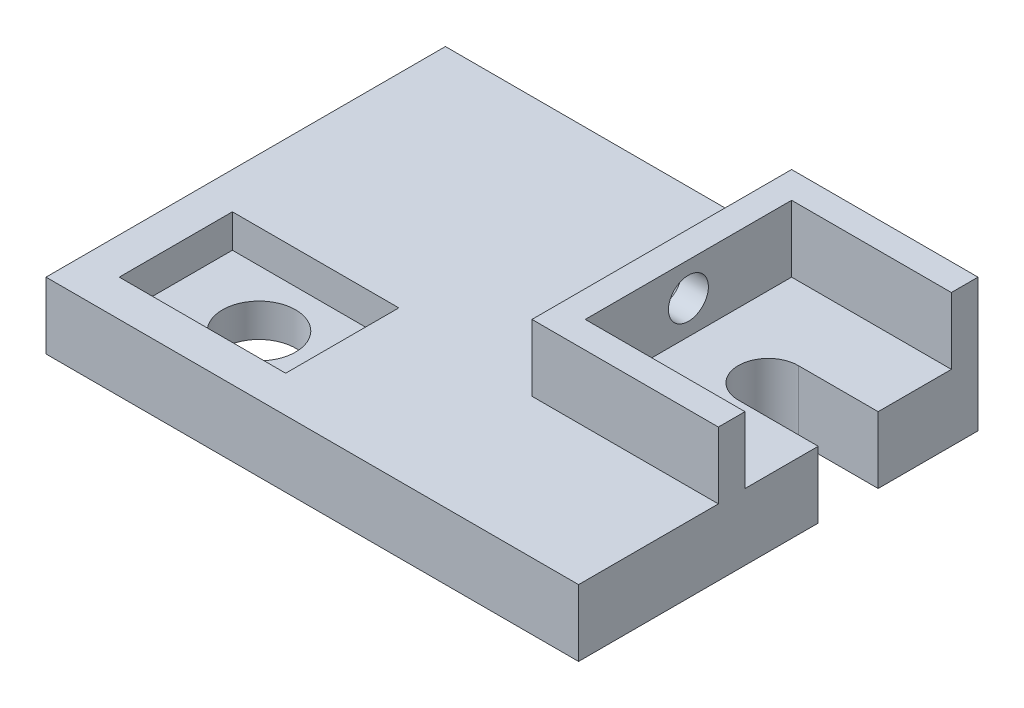
ISO-10303-21;
HEADER;
FILE_DESCRIPTION(('STEP AP214'),'2;1');
FILE_NAME('part.step','',(''),(''),'','','');
FILE_SCHEMA(('AUTOMOTIVE_DESIGN { 1 0 10303 214 1 1 1 1 }'));
ENDSEC;
DATA;
#1=APPLICATION_CONTEXT('core data for automotive mechanical design processes');
#2=APPLICATION_PROTOCOL_DEFINITION('international standard','automotive_design',2000,#1);
#3=PRODUCT_CONTEXT('',#1,'mechanical');
#4=PRODUCT('Part','Part','',(#3));
#5=PRODUCT_RELATED_PRODUCT_CATEGORY('part','',(#4));
#6=PRODUCT_DEFINITION_FORMATION('','',#4);
#7=PRODUCT_DEFINITION_CONTEXT('part definition',#1,'design');
#8=PRODUCT_DEFINITION('design','',#6,#7);
#9=PRODUCT_DEFINITION_SHAPE('','',#8);
#10=(LENGTH_UNIT() NAMED_UNIT(*) SI_UNIT(.MILLI.,.METRE.));
#11=(NAMED_UNIT(*) PLANE_ANGLE_UNIT() SI_UNIT($,.RADIAN.));
#12=(NAMED_UNIT(*) SI_UNIT($,.STERADIAN.) SOLID_ANGLE_UNIT());
#13=UNCERTAINTY_MEASURE_WITH_UNIT(LENGTH_MEASURE(1.E-05),#10,'distance_accuracy_value','');
#14=(GEOMETRIC_REPRESENTATION_CONTEXT(3) GLOBAL_UNCERTAINTY_ASSIGNED_CONTEXT((#13)) GLOBAL_UNIT_ASSIGNED_CONTEXT((#10,
#11,#12)) REPRESENTATION_CONTEXT('',''));
#15=CARTESIAN_POINT('',(0.,0.,0.));
#16=DIRECTION('',(0.,0.,1.));
#17=DIRECTION('',(1.,0.,0.));
#18=AXIS2_PLACEMENT_3D('',#15,#16,#17);
#19=CARTESIAN_POINT('',(-22.,0.,16.));
#20=DIRECTION('',(0.,1.,0.));
#21=DIRECTION('',(0.,0.,1.));
#22=AXIS2_PLACEMENT_3D('',#19,#20,#21);
#23=CYLINDRICAL_SURFACE('',#22,5.5);
#24=CARTESIAN_POINT('',(-22.,0.,16.));
#25=DIRECTION('',(0.,1.,0.));
#26=DIRECTION('',(0.,0.,1.));
#27=AXIS2_PLACEMENT_3D('',#24,#25,#26);
#28=CIRCLE('',#27,5.5);
#29=CARTESIAN_POINT('',(-22.,0.,21.5));
#30=VERTEX_POINT('',#29);
#31=EDGE_CURVE('E317',#30,#30,#28,.T.);
#32=ORIENTED_EDGE('',*,*,#31,.F.);
#33=EDGE_LOOP('',(#32));
#34=FACE_BOUND('',#33,.T.);
#35=CARTESIAN_POINT('',(-22.,5.,16.));
#36=DIRECTION('',(0.,1.,0.));
#37=DIRECTION('',(0.,0.,1.));
#38=AXIS2_PLACEMENT_3D('',#35,#36,#37);
#39=CIRCLE('',#38,5.5);
#40=CARTESIAN_POINT('',(-22.,5.,21.5));
#41=VERTEX_POINT('',#40);
#42=EDGE_CURVE('E53',#41,#41,#39,.F.);
#43=ORIENTED_EDGE('',*,*,#42,.F.);
#44=EDGE_LOOP('',(#43));
#45=FACE_BOUND('',#44,.T.);
#46=ADVANCED_FACE('F49',(#34,#45),#23,.F.);
#47=CARTESIAN_POINT('',(0.,10.,0.));
#48=DIRECTION('',(0.,-1.,0.));
#49=DIRECTION('',(0.,0.,-1.));
#50=AXIS2_PLACEMENT_3D('',#47,#48,#49);
#51=PLANE('',#50);
#52=DIRECTION('',(0.,0.,-1.));
#53=VECTOR('',#52,1.);
#54=CARTESIAN_POINT('',(40.,10.,30.));
#55=LINE('',#54,#53);
#56=CARTESIAN_POINT('',(40.,10.,-15.));
#57=VERTEX_POINT('',#56);
#58=CARTESIAN_POINT('',(40.,10.,-26.));
#59=VERTEX_POINT('',#58);
#60=EDGE_CURVE('E334',#57,#59,#55,.T.);
#61=ORIENTED_EDGE('',*,*,#60,.T.);
#62=DIRECTION('',(-1.,0.,0.));
#63=VECTOR('',#62,1.);
#64=CARTESIAN_POINT('',(0.,10.,-26.));
#65=LINE('',#64,#63);
#66=CARTESIAN_POINT('',(16.,10.,-26.));
#67=VERTEX_POINT('',#66);
#68=EDGE_CURVE('E74',#59,#67,#65,.T.);
#69=ORIENTED_EDGE('',*,*,#68,.T.);
#70=DIRECTION('',(0.,0.,1.));
#71=VECTOR('',#70,1.);
#72=CARTESIAN_POINT('',(16.,10.,0.));
#73=LINE('',#72,#71);
#74=CARTESIAN_POINT('',(16.,10.,5.00000000000001));
#75=VERTEX_POINT('',#74);
#76=EDGE_CURVE('E230',#67,#75,#73,.T.);
#77=ORIENTED_EDGE('',*,*,#76,.T.);
#78=DIRECTION('',(-1.,0.,0.));
#79=VECTOR('',#78,1.);
#80=CARTESIAN_POINT('',(0.,10.,5.00000000000001));
#81=LINE('',#80,#79);
#82=CARTESIAN_POINT('',(40.,10.,5.00000000000001));
#83=VERTEX_POINT('',#82);
#84=EDGE_CURVE('E258',#83,#75,#81,.T.);
#85=ORIENTED_EDGE('',*,*,#84,.F.);
#86=CARTESIAN_POINT('',(40.,10.,-6.));
#87=VERTEX_POINT('',#86);
#88=EDGE_CURVE('E285',#83,#87,#55,.T.);
#89=ORIENTED_EDGE('',*,*,#88,.T.);
#90=DIRECTION('',(1.,0.,0.));
#91=VECTOR('',#90,1.);
#92=CARTESIAN_POINT('',(0.,10.,-6.));
#93=LINE('',#92,#91);
#94=CARTESIAN_POINT('',(28.,10.,-6.));
#95=VERTEX_POINT('',#94);
#96=EDGE_CURVE('E300',#95,#87,#93,.T.);
#97=ORIENTED_EDGE('',*,*,#96,.F.);
#98=CARTESIAN_POINT('',(28.,10.,-10.5));
#99=DIRECTION('',(0.,1.,0.));
#100=DIRECTION('',(0.,0.,1.));
#101=AXIS2_PLACEMENT_3D('',#98,#99,#100);
#102=CIRCLE('',#101,4.5);
#103=CARTESIAN_POINT('',(28.,10.,-15.));
#104=VERTEX_POINT('',#103);
#105=EDGE_CURVE('E295',#104,#95,#102,.T.);
#106=ORIENTED_EDGE('',*,*,#105,.F.);
#107=DIRECTION('',(-1.,0.,0.));
#108=VECTOR('',#107,1.);
#109=CARTESIAN_POINT('',(0.,10.,-15.));
#110=LINE('',#109,#108);
#111=EDGE_CURVE('E306',#57,#104,#110,.T.);
#112=ORIENTED_EDGE('',*,*,#111,.F.);
#113=EDGE_LOOP('',(#61,#69,#77,#85,#89,#97,#106,#112));
#114=FACE_BOUND('',#113,.T.);
#115=ADVANCED_FACE('F343',(#114),#51,.F.);
#116=CARTESIAN_POINT('',(40.,10.,30.));
#117=DIRECTION('',(-1.,0.,0.));
#118=DIRECTION('',(0.,0.,1.));
#119=AXIS2_PLACEMENT_3D('',#116,#117,#118);
#120=PLANE('',#119);
#121=ORIENTED_EDGE('',*,*,#60,.F.);
#122=DIRECTION('',(0.,1.,0.));
#123=VECTOR('',#122,1.);
#124=CARTESIAN_POINT('',(40.,0.,-15.));
#125=LINE('',#124,#123);
#126=CARTESIAN_POINT('',(40.,0.,-15.));
#127=VERTEX_POINT('',#126);
#128=EDGE_CURVE('E318',#127,#57,#125,.T.);
#129=ORIENTED_EDGE('',*,*,#128,.F.);
#130=DIRECTION('',(0.,0.,-1.));
#131=VECTOR('',#130,1.);
#132=CARTESIAN_POINT('',(40.,0.,30.));
#133=LINE('',#132,#131);
#134=CARTESIAN_POINT('',(40.,0.,-30.));
#135=VERTEX_POINT('',#134);
#136=EDGE_CURVE('E326',#127,#135,#133,.T.);
#137=ORIENTED_EDGE('',*,*,#136,.T.);
#138=DIRECTION('',(0.,-1.,0.));
#139=VECTOR('',#138,1.);
#140=CARTESIAN_POINT('',(40.,10.,-30.));
#141=LINE('',#140,#139);
#142=CARTESIAN_POINT('',(40.,20.,-30.));
#143=VERTEX_POINT('',#142);
#144=EDGE_CURVE('E13',#143,#135,#141,.T.);
#145=ORIENTED_EDGE('',*,*,#144,.F.);
#146=DIRECTION('',(0.,0.,-1.));
#147=VECTOR('',#146,1.);
#148=CARTESIAN_POINT('',(40.,20.,0.));
#149=LINE('',#148,#147);
#150=CARTESIAN_POINT('',(40.,20.,-26.));
#151=VERTEX_POINT('',#150);
#152=EDGE_CURVE('E229',#151,#143,#149,.T.);
#153=ORIENTED_EDGE('',*,*,#152,.F.);
#154=DIRECTION('',(0.,-1.,0.));
#155=VECTOR('',#154,1.);
#156=CARTESIAN_POINT('',(40.,20.,-26.));
#157=LINE('',#156,#155);
#158=EDGE_CURVE('E292',#151,#59,#157,.T.);
#159=ORIENTED_EDGE('',*,*,#158,.T.);
#160=EDGE_LOOP('',(#121,#129,#137,#145,#153,#159));
#161=FACE_BOUND('',#160,.T.);
#162=ADVANCED_FACE('F397',(#161),#120,.F.);
#163=CARTESIAN_POINT('',(40.,0.,30.));
#164=VERTEX_POINT('',#163);
#165=CARTESIAN_POINT('',(40.,0.,-6.));
#166=VERTEX_POINT('',#165);
#167=EDGE_CURVE('E353',#164,#166,#133,.T.);
#168=ORIENTED_EDGE('',*,*,#167,.T.);
#169=DIRECTION('',(0.,1.,0.));
#170=VECTOR('',#169,1.);
#171=CARTESIAN_POINT('',(40.,0.,-6.));
#172=LINE('',#171,#170);
#173=EDGE_CURVE('E320',#166,#87,#172,.T.);
#174=ORIENTED_EDGE('',*,*,#173,.T.);
#175=ORIENTED_EDGE('',*,*,#88,.F.);
#176=DIRECTION('',(0.,-1.,0.));
#177=VECTOR('',#176,1.);
#178=CARTESIAN_POINT('',(40.,20.,5.00000000000001));
#179=LINE('',#178,#177);
#180=CARTESIAN_POINT('',(40.,20.,5.00000000000001));
#181=VERTEX_POINT('',#180);
#182=EDGE_CURVE('E264',#181,#83,#179,.T.);
#183=ORIENTED_EDGE('',*,*,#182,.F.);
#184=DIRECTION('',(0.,0.,-1.));
#185=VECTOR('',#184,1.);
#186=CARTESIAN_POINT('',(40.,20.,0.));
#187=LINE('',#186,#185);
#188=CARTESIAN_POINT('',(40.,20.,9.00000000000001));
#189=VERTEX_POINT('',#188);
#190=EDGE_CURVE('E240',#189,#181,#187,.T.);
#191=ORIENTED_EDGE('',*,*,#190,.F.);
#192=DIRECTION('',(0.,-1.,0.));
#193=VECTOR('',#192,1.);
#194=CARTESIAN_POINT('',(40.,20.,9.00000000000001));
#195=LINE('',#194,#193);
#196=CARTESIAN_POINT('',(40.,10.,9.));
#197=VERTEX_POINT('',#196);
#198=EDGE_CURVE('E267',#189,#197,#195,.T.);
#199=ORIENTED_EDGE('',*,*,#198,.T.);
#200=CARTESIAN_POINT('',(40.,10.,30.));
#201=VERTEX_POINT('',#200);
#202=EDGE_CURVE('E340',#201,#197,#55,.T.);
#203=ORIENTED_EDGE('',*,*,#202,.F.);
#204=DIRECTION('',(0.,-1.,0.));
#205=VECTOR('',#204,1.);
#206=CARTESIAN_POINT('',(40.,10.,30.));
#207=LINE('',#206,#205);
#208=EDGE_CURVE('E355',#201,#164,#207,.T.);
#209=ORIENTED_EDGE('',*,*,#208,.T.);
#210=EDGE_LOOP('',(#168,#174,#175,#183,#191,#199,#203,#209));
#211=FACE_BOUND('',#210,.T.);
#212=ADVANCED_FACE('F51',(#211),#120,.F.);
#213=CARTESIAN_POINT('',(-40.,10.,-30.));
#214=DIRECTION('',(0.,0.,1.));
#215=DIRECTION('',(1.,0.,0.));
#216=AXIS2_PLACEMENT_3D('',#213,#214,#215);
#217=PLANE('',#216);
#218=DIRECTION('',(-1.,0.,0.));
#219=VECTOR('',#218,1.);
#220=CARTESIAN_POINT('',(-40.,0.,-30.));
#221=LINE('',#220,#219);
#222=CARTESIAN_POINT('',(-40.,0.,-30.));
#223=VERTEX_POINT('',#222);
#224=EDGE_CURVE('E358',#135,#223,#221,.T.);
#225=ORIENTED_EDGE('',*,*,#224,.T.);
#226=DIRECTION('',(0.,-1.,0.));
#227=VECTOR('',#226,1.);
#228=CARTESIAN_POINT('',(-40.,10.,-30.));
#229=LINE('',#228,#227);
#230=CARTESIAN_POINT('',(-40.,10.,-30.));
#231=VERTEX_POINT('',#230);
#232=EDGE_CURVE('E58',#231,#223,#229,.T.);
#233=ORIENTED_EDGE('',*,*,#232,.F.);
#234=DIRECTION('',(-1.,0.,0.));
#235=VECTOR('',#234,1.);
#236=CARTESIAN_POINT('',(-40.,10.,-30.));
#237=LINE('',#236,#235);
#238=CARTESIAN_POINT('',(12.,10.,-30.));
#239=VERTEX_POINT('',#238);
#240=EDGE_CURVE('E338',#239,#231,#237,.T.);
#241=ORIENTED_EDGE('',*,*,#240,.F.);
#242=DIRECTION('',(0.,-1.,0.));
#243=VECTOR('',#242,1.);
#244=CARTESIAN_POINT('',(12.,20.,-30.));
#245=LINE('',#244,#243);
#246=CARTESIAN_POINT('',(12.,20.,-30.));
#247=VERTEX_POINT('',#246);
#248=EDGE_CURVE('E290',#247,#239,#245,.T.);
#249=ORIENTED_EDGE('',*,*,#248,.F.);
#250=DIRECTION('',(-1.,0.,0.));
#251=VECTOR('',#250,1.);
#252=CARTESIAN_POINT('',(0.,20.,-30.));
#253=LINE('',#252,#251);
#254=EDGE_CURVE('E233',#143,#247,#253,.T.);
#255=ORIENTED_EDGE('',*,*,#254,.F.);
#256=ORIENTED_EDGE('',*,*,#144,.T.);
#257=EDGE_LOOP('',(#225,#233,#241,#249,#255,#256));
#258=FACE_BOUND('',#257,.T.);
#259=ADVANCED_FACE('F389',(#258),#217,.F.);
#260=CARTESIAN_POINT('',(-40.,10.,30.));
#261=DIRECTION('',(1.,0.,0.));
#262=DIRECTION('',(0.,0.,-1.));
#263=AXIS2_PLACEMENT_3D('',#260,#261,#262);
#264=PLANE('',#263);
#265=DIRECTION('',(0.,0.,1.));
#266=VECTOR('',#265,1.);
#267=CARTESIAN_POINT('',(-40.,0.,30.));
#268=LINE('',#267,#266);
#269=CARTESIAN_POINT('',(-40.,0.,30.));
#270=VERTEX_POINT('',#269);
#271=EDGE_CURVE('E360',#223,#270,#268,.T.);
#272=ORIENTED_EDGE('',*,*,#271,.T.);
#273=DIRECTION('',(0.,-1.,0.));
#274=VECTOR('',#273,1.);
#275=CARTESIAN_POINT('',(-40.,10.,30.));
#276=LINE('',#275,#274);
#277=CARTESIAN_POINT('',(-40.,10.,30.));
#278=VERTEX_POINT('',#277);
#279=EDGE_CURVE('E368',#278,#270,#276,.T.);
#280=ORIENTED_EDGE('',*,*,#279,.F.);
#281=DIRECTION('',(0.,0.,1.));
#282=VECTOR('',#281,1.);
#283=CARTESIAN_POINT('',(-40.,10.,30.));
#284=LINE('',#283,#282);
#285=EDGE_CURVE('E339',#231,#278,#284,.T.);
#286=ORIENTED_EDGE('',*,*,#285,.F.);
#287=ORIENTED_EDGE('',*,*,#232,.T.);
#288=EDGE_LOOP('',(#272,#280,#286,#287));
#289=FACE_BOUND('',#288,.T.);
#290=ADVANCED_FACE('F375',(#289),#264,.F.);
#291=CARTESIAN_POINT('',(-40.,10.,30.));
#292=DIRECTION('',(0.,0.,-1.));
#293=DIRECTION('',(-1.,0.,0.));
#294=AXIS2_PLACEMENT_3D('',#291,#292,#293);
#295=PLANE('',#294);
#296=DIRECTION('',(1.,0.,0.));
#297=VECTOR('',#296,1.);
#298=CARTESIAN_POINT('',(-40.,0.,30.));
#299=LINE('',#298,#297);
#300=EDGE_CURVE('E336',#270,#164,#299,.T.);
#301=ORIENTED_EDGE('',*,*,#300,.T.);
#302=ORIENTED_EDGE('',*,*,#208,.F.);
#303=DIRECTION('',(1.,0.,0.));
#304=VECTOR('',#303,1.);
#305=CARTESIAN_POINT('',(-40.,10.,30.));
#306=LINE('',#305,#304);
#307=EDGE_CURVE('E363',#278,#201,#306,.T.);
#308=ORIENTED_EDGE('',*,*,#307,.F.);
#309=ORIENTED_EDGE('',*,*,#279,.T.);
#310=EDGE_LOOP('',(#301,#302,#308,#309));
#311=FACE_BOUND('',#310,.T.);
#312=ADVANCED_FACE('F385',(#311),#295,.F.);
#313=DIRECTION('',(-1.,0.,0.));
#314=VECTOR('',#313,1.);
#315=CARTESIAN_POINT('',(-9.50000000000001,10.,7.5));
#316=LINE('',#315,#314);
#317=CARTESIAN_POINT('',(-9.50000000000001,10.,7.5));
#318=VERTEX_POINT('',#317);
#319=CARTESIAN_POINT('',(-34.5,10.,7.5));
#320=VERTEX_POINT('',#319);
#321=EDGE_CURVE('E211',#318,#320,#316,.T.);
#322=ORIENTED_EDGE('',*,*,#321,.F.);
#323=DIRECTION('',(0.,0.,-1.));
#324=VECTOR('',#323,1.);
#325=CARTESIAN_POINT('',(-9.50000000000001,10.,24.5));
#326=LINE('',#325,#324);
#327=CARTESIAN_POINT('',(-9.50000000000001,10.,24.5));
#328=VERTEX_POINT('',#327);
#329=EDGE_CURVE('E66',#328,#318,#326,.T.);
#330=ORIENTED_EDGE('',*,*,#329,.F.);
#331=DIRECTION('',(-1.,0.,0.));
#332=VECTOR('',#331,1.);
#333=CARTESIAN_POINT('',(-9.50000000000001,10.,24.5));
#334=LINE('',#333,#332);
#335=CARTESIAN_POINT('',(-34.5,10.,24.5));
#336=VERTEX_POINT('',#335);
#337=EDGE_CURVE('E202',#328,#336,#334,.T.);
#338=ORIENTED_EDGE('',*,*,#337,.T.);
#339=DIRECTION('',(0.,0.,-1.));
#340=VECTOR('',#339,1.);
#341=CARTESIAN_POINT('',(-34.5,10.,24.5));
#342=LINE('',#341,#340);
#343=EDGE_CURVE('E205',#336,#320,#342,.T.);
#344=ORIENTED_EDGE('',*,*,#343,.T.);
#345=EDGE_LOOP('',(#322,#330,#338,#344));
#346=FACE_BOUND('',#345,.T.);
#347=ORIENTED_EDGE('',*,*,#202,.T.);
#348=DIRECTION('',(-1.,0.,0.));
#349=VECTOR('',#348,1.);
#350=CARTESIAN_POINT('',(0.,10.,9.));
#351=LINE('',#350,#349);
#352=CARTESIAN_POINT('',(12.,10.,9.));
#353=VERTEX_POINT('',#352);
#354=EDGE_CURVE('E261',#197,#353,#351,.T.);
#355=ORIENTED_EDGE('',*,*,#354,.T.);
#356=DIRECTION('',(0.,0.,1.));
#357=VECTOR('',#356,1.);
#358=CARTESIAN_POINT('',(12.,10.,0.));
#359=LINE('',#358,#357);
#360=EDGE_CURVE('E255',#239,#353,#359,.T.);
#361=ORIENTED_EDGE('',*,*,#360,.F.);
#362=ORIENTED_EDGE('',*,*,#240,.T.);
#363=ORIENTED_EDGE('',*,*,#285,.T.);
#364=ORIENTED_EDGE('',*,*,#307,.T.);
#365=EDGE_LOOP('',(#347,#355,#361,#362,#363,#364));
#366=FACE_BOUND('',#365,.T.);
#367=ADVANCED_FACE('F387',(#346,#366),#51,.F.);
#368=CARTESIAN_POINT('',(0.,0.,0.));
#369=DIRECTION('',(0.,-1.,0.));
#370=DIRECTION('',(0.,0.,-1.));
#371=AXIS2_PLACEMENT_3D('',#368,#369,#370);
#372=PLANE('',#371);
#373=DIRECTION('',(-1.,0.,0.));
#374=VECTOR('',#373,1.);
#375=CARTESIAN_POINT('',(0.,0.,-15.));
#376=LINE('',#375,#374);
#377=CARTESIAN_POINT('',(28.,0.,-15.));
#378=VERTEX_POINT('',#377);
#379=EDGE_CURVE('E309',#127,#378,#376,.T.);
#380=ORIENTED_EDGE('',*,*,#379,.T.);
#381=CARTESIAN_POINT('',(28.,0.,-10.5));
#382=DIRECTION('',(0.,1.,0.));
#383=DIRECTION('',(0.,0.,1.));
#384=AXIS2_PLACEMENT_3D('',#381,#382,#383);
#385=CIRCLE('',#384,4.5);
#386=CARTESIAN_POINT('',(28.,0.,-6.));
#387=VERTEX_POINT('',#386);
#388=EDGE_CURVE('E314',#378,#387,#385,.T.);
#389=ORIENTED_EDGE('',*,*,#388,.T.);
#390=DIRECTION('',(1.,0.,0.));
#391=VECTOR('',#390,1.);
#392=CARTESIAN_POINT('',(0.,0.,-6.));
#393=LINE('',#392,#391);
#394=EDGE_CURVE('E402',#387,#166,#393,.T.);
#395=ORIENTED_EDGE('',*,*,#394,.T.);
#396=ORIENTED_EDGE('',*,*,#167,.F.);
#397=ORIENTED_EDGE('',*,*,#300,.F.);
#398=ORIENTED_EDGE('',*,*,#271,.F.);
#399=ORIENTED_EDGE('',*,*,#224,.F.);
#400=ORIENTED_EDGE('',*,*,#136,.F.);
#401=EDGE_LOOP('',(#380,#389,#395,#396,#397,#398,#399,#400));
#402=FACE_BOUND('',#401,.T.);
#403=ORIENTED_EDGE('',*,*,#31,.T.);
#404=EDGE_LOOP('',(#403));
#405=FACE_BOUND('',#404,.T.);
#406=ADVANCED_FACE('F381',(#402,#405),#372,.T.);
#407=CARTESIAN_POINT('',(28.,0.,-10.5));
#408=DIRECTION('',(0.,1.,0.));
#409=DIRECTION('',(0.,0.,1.));
#410=AXIS2_PLACEMENT_3D('',#407,#408,#409);
#411=CYLINDRICAL_SURFACE('',#410,4.5);
#412=ORIENTED_EDGE('',*,*,#105,.T.);
#413=DIRECTION('',(0.,1.,0.));
#414=VECTOR('',#413,1.);
#415=CARTESIAN_POINT('',(28.,0.,-6.));
#416=LINE('',#415,#414);
#417=EDGE_CURVE('E323',#387,#95,#416,.T.);
#418=ORIENTED_EDGE('',*,*,#417,.F.);
#419=ORIENTED_EDGE('',*,*,#388,.F.);
#420=DIRECTION('',(0.,1.,0.));
#421=VECTOR('',#420,1.);
#422=CARTESIAN_POINT('',(28.,0.,-15.));
#423=LINE('',#422,#421);
#424=EDGE_CURVE('E315',#378,#104,#423,.T.);
#425=ORIENTED_EDGE('',*,*,#424,.T.);
#426=EDGE_LOOP('',(#412,#418,#419,#425));
#427=FACE_BOUND('',#426,.T.);
#428=ADVANCED_FACE('F441',(#427),#411,.F.);
#429=CARTESIAN_POINT('',(0.,0.,-15.));
#430=DIRECTION('',(0.,0.,-1.));
#431=DIRECTION('',(-1.,0.,0.));
#432=AXIS2_PLACEMENT_3D('',#429,#430,#431);
#433=PLANE('',#432);
#434=ORIENTED_EDGE('',*,*,#111,.T.);
#435=ORIENTED_EDGE('',*,*,#424,.F.);
#436=ORIENTED_EDGE('',*,*,#379,.F.);
#437=ORIENTED_EDGE('',*,*,#128,.T.);
#438=EDGE_LOOP('',(#434,#435,#436,#437));
#439=FACE_BOUND('',#438,.T.);
#440=ADVANCED_FACE('F428',(#439),#433,.F.);
#441=CARTESIAN_POINT('',(0.,0.,-6.));
#442=DIRECTION('',(0.,0.,1.));
#443=DIRECTION('',(1.,0.,0.));
#444=AXIS2_PLACEMENT_3D('',#441,#442,#443);
#445=PLANE('',#444);
#446=ORIENTED_EDGE('',*,*,#96,.T.);
#447=ORIENTED_EDGE('',*,*,#173,.F.);
#448=ORIENTED_EDGE('',*,*,#394,.F.);
#449=ORIENTED_EDGE('',*,*,#417,.T.);
#450=EDGE_LOOP('',(#446,#447,#448,#449));
#451=FACE_BOUND('',#450,.T.);
#452=ADVANCED_FACE('F347',(#451),#445,.F.);
#453=CARTESIAN_POINT('',(0.,20.,-26.));
#454=DIRECTION('',(0.,0.,1.));
#455=DIRECTION('',(1.,0.,0.));
#456=AXIS2_PLACEMENT_3D('',#453,#454,#455);
#457=PLANE('',#456);
#458=ORIENTED_EDGE('',*,*,#68,.F.);
#459=ORIENTED_EDGE('',*,*,#158,.F.);
#460=DIRECTION('',(-1.,0.,0.));
#461=VECTOR('',#460,1.);
#462=CARTESIAN_POINT('',(0.,20.,-26.));
#463=LINE('',#462,#461);
#464=CARTESIAN_POINT('',(16.,20.,-26.));
#465=VERTEX_POINT('',#464);
#466=EDGE_CURVE('E226',#151,#465,#463,.T.);
#467=ORIENTED_EDGE('',*,*,#466,.T.);
#468=DIRECTION('',(0.,-1.,0.));
#469=VECTOR('',#468,1.);
#470=CARTESIAN_POINT('',(16.,20.,-26.));
#471=LINE('',#470,#469);
#472=EDGE_CURVE('E247',#465,#67,#471,.T.);
#473=ORIENTED_EDGE('',*,*,#472,.T.);
#474=EDGE_LOOP('',(#458,#459,#467,#473));
#475=FACE_BOUND('',#474,.T.);
#476=ADVANCED_FACE('F418',(#475),#457,.T.);
#477=CARTESIAN_POINT('',(12.,20.,0.));
#478=DIRECTION('',(1.,0.,0.));
#479=DIRECTION('',(0.,0.,-1.));
#480=AXIS2_PLACEMENT_3D('',#477,#478,#479);
#481=PLANE('',#480);
#482=CARTESIAN_POINT('',(12.,15.,-10.5));
#483=DIRECTION('',(1.,0.,0.));
#484=DIRECTION('',(0.,0.,-1.));
#485=AXIS2_PLACEMENT_3D('',#482,#483,#484);
#486=CIRCLE('',#485,3.);
#487=CARTESIAN_POINT('',(12.,15.,-13.5));
#488=VERTEX_POINT('',#487);
#489=EDGE_CURVE('E223',#488,#488,#486,.T.);
#490=ORIENTED_EDGE('',*,*,#489,.T.);
#491=EDGE_LOOP('',(#490));
#492=FACE_BOUND('',#491,.T.);
#493=ORIENTED_EDGE('',*,*,#360,.T.);
#494=DIRECTION('',(0.,-1.,0.));
#495=VECTOR('',#494,1.);
#496=CARTESIAN_POINT('',(12.,20.,9.));
#497=LINE('',#496,#495);
#498=CARTESIAN_POINT('',(12.,20.,9.));
#499=VERTEX_POINT('',#498);
#500=EDGE_CURVE('E273',#499,#353,#497,.T.);
#501=ORIENTED_EDGE('',*,*,#500,.F.);
#502=DIRECTION('',(0.,0.,1.));
#503=VECTOR('',#502,1.);
#504=CARTESIAN_POINT('',(12.,20.,0.));
#505=LINE('',#504,#503);
#506=EDGE_CURVE('E235',#247,#499,#505,.T.);
#507=ORIENTED_EDGE('',*,*,#506,.F.);
#508=ORIENTED_EDGE('',*,*,#248,.T.);
#509=EDGE_LOOP('',(#493,#501,#507,#508));
#510=FACE_BOUND('',#509,.T.);
#511=ADVANCED_FACE('F392',(#492,#510),#481,.F.);
#512=CARTESIAN_POINT('',(0.,20.,9.));
#513=DIRECTION('',(0.,0.,1.));
#514=DIRECTION('',(1.,0.,0.));
#515=AXIS2_PLACEMENT_3D('',#512,#513,#514);
#516=PLANE('',#515);
#517=ORIENTED_EDGE('',*,*,#354,.F.);
#518=ORIENTED_EDGE('',*,*,#198,.F.);
#519=DIRECTION('',(-1.,0.,0.));
#520=VECTOR('',#519,1.);
#521=CARTESIAN_POINT('',(0.,20.,9.));
#522=LINE('',#521,#520);
#523=EDGE_CURVE('E237',#189,#499,#522,.T.);
#524=ORIENTED_EDGE('',*,*,#523,.T.);
#525=ORIENTED_EDGE('',*,*,#500,.T.);
#526=EDGE_LOOP('',(#517,#518,#524,#525));
#527=FACE_BOUND('',#526,.T.);
#528=ADVANCED_FACE('F425',(#527),#516,.T.);
#529=CARTESIAN_POINT('',(0.,20.,5.00000000000001));
#530=DIRECTION('',(0.,0.,1.));
#531=DIRECTION('',(1.,0.,0.));
#532=AXIS2_PLACEMENT_3D('',#529,#530,#531);
#533=PLANE('',#532);
#534=ORIENTED_EDGE('',*,*,#84,.T.);
#535=DIRECTION('',(0.,-1.,0.));
#536=VECTOR('',#535,1.);
#537=CARTESIAN_POINT('',(16.,20.,5.00000000000001));
#538=LINE('',#537,#536);
#539=CARTESIAN_POINT('',(16.,20.,5.00000000000001));
#540=VERTEX_POINT('',#539);
#541=EDGE_CURVE('E268',#540,#75,#538,.T.);
#542=ORIENTED_EDGE('',*,*,#541,.F.);
#543=DIRECTION('',(-1.,0.,0.));
#544=VECTOR('',#543,1.);
#545=CARTESIAN_POINT('',(0.,20.,5.00000000000001));
#546=LINE('',#545,#544);
#547=EDGE_CURVE('E242',#181,#540,#546,.T.);
#548=ORIENTED_EDGE('',*,*,#547,.F.);
#549=ORIENTED_EDGE('',*,*,#182,.T.);
#550=EDGE_LOOP('',(#534,#542,#548,#549));
#551=FACE_BOUND('',#550,.T.);
#552=ADVANCED_FACE('F415',(#551),#533,.F.);
#553=CARTESIAN_POINT('',(16.,20.,0.));
#554=DIRECTION('',(1.,0.,0.));
#555=DIRECTION('',(0.,0.,-1.));
#556=AXIS2_PLACEMENT_3D('',#553,#554,#555);
#557=PLANE('',#556);
#558=CARTESIAN_POINT('',(16.,15.,-10.5));
#559=DIRECTION('',(1.,0.,0.));
#560=DIRECTION('',(0.,0.,-1.));
#561=AXIS2_PLACEMENT_3D('',#558,#559,#560);
#562=CIRCLE('',#561,3.);
#563=CARTESIAN_POINT('',(16.,15.,-13.5));
#564=VERTEX_POINT('',#563);
#565=EDGE_CURVE('E220',#564,#564,#562,.T.);
#566=ORIENTED_EDGE('',*,*,#565,.F.);
#567=EDGE_LOOP('',(#566));
#568=FACE_BOUND('',#567,.T.);
#569=ORIENTED_EDGE('',*,*,#76,.F.);
#570=ORIENTED_EDGE('',*,*,#472,.F.);
#571=DIRECTION('',(0.,0.,1.));
#572=VECTOR('',#571,1.);
#573=CARTESIAN_POINT('',(16.,20.,0.));
#574=LINE('',#573,#572);
#575=EDGE_CURVE('E244',#465,#540,#574,.T.);
#576=ORIENTED_EDGE('',*,*,#575,.T.);
#577=ORIENTED_EDGE('',*,*,#541,.T.);
#578=EDGE_LOOP('',(#569,#570,#576,#577));
#579=FACE_BOUND('',#578,.T.);
#580=ADVANCED_FACE('F411',(#568,#579),#557,.T.);
#581=CARTESIAN_POINT('',(0.,20.,0.));
#582=DIRECTION('',(0.,1.,0.));
#583=DIRECTION('',(0.,0.,1.));
#584=AXIS2_PLACEMENT_3D('',#581,#582,#583);
#585=PLANE('',#584);
#586=ORIENTED_EDGE('',*,*,#466,.F.);
#587=ORIENTED_EDGE('',*,*,#152,.T.);
#588=ORIENTED_EDGE('',*,*,#254,.T.);
#589=ORIENTED_EDGE('',*,*,#506,.T.);
#590=ORIENTED_EDGE('',*,*,#523,.F.);
#591=ORIENTED_EDGE('',*,*,#190,.T.);
#592=ORIENTED_EDGE('',*,*,#547,.T.);
#593=ORIENTED_EDGE('',*,*,#575,.F.);
#594=EDGE_LOOP('',(#586,#587,#588,#589,#590,#591,#592,#593));
#595=FACE_BOUND('',#594,.T.);
#596=ADVANCED_FACE('F396',(#595),#585,.T.);
#597=CARTESIAN_POINT('',(-40.000025,15.,-10.5));
#598=DIRECTION('',(1.,0.,0.));
#599=DIRECTION('',(0.,0.,-1.));
#600=AXIS2_PLACEMENT_3D('',#597,#598,#599);
#601=CYLINDRICAL_SURFACE('',#600,3.);
#602=ORIENTED_EDGE('',*,*,#565,.T.);
#603=EDGE_LOOP('',(#602));
#604=FACE_BOUND('',#603,.T.);
#605=ORIENTED_EDGE('',*,*,#489,.F.);
#606=EDGE_LOOP('',(#605));
#607=FACE_BOUND('',#606,.T.);
#608=ADVANCED_FACE('F563',(#604,#607),#601,.F.);
#609=CARTESIAN_POINT('',(0.,5.,0.));
#610=DIRECTION('',(0.,1.,0.));
#611=DIRECTION('',(0.,0.,1.));
#612=AXIS2_PLACEMENT_3D('',#609,#610,#611);
#613=PLANE('',#612);
#614=DIRECTION('',(0.,0.,-1.));
#615=VECTOR('',#614,1.);
#616=CARTESIAN_POINT('',(-9.50000000000001,5.,24.5));
#617=LINE('',#616,#615);
#618=CARTESIAN_POINT('',(-9.50000000000001,5.,24.5));
#619=VERTEX_POINT('',#618);
#620=CARTESIAN_POINT('',(-9.50000000000001,5.,7.5));
#621=VERTEX_POINT('',#620);
#622=EDGE_CURVE('E184',#619,#621,#617,.T.);
#623=ORIENTED_EDGE('',*,*,#622,.T.);
#624=DIRECTION('',(-1.,0.,0.));
#625=VECTOR('',#624,1.);
#626=CARTESIAN_POINT('',(-9.50000000000001,5.,7.5));
#627=LINE('',#626,#625);
#628=CARTESIAN_POINT('',(-34.5,5.,7.5));
#629=VERTEX_POINT('',#628);
#630=EDGE_CURVE('E193',#621,#629,#627,.T.);
#631=ORIENTED_EDGE('',*,*,#630,.T.);
#632=DIRECTION('',(0.,0.,-1.));
#633=VECTOR('',#632,1.);
#634=CARTESIAN_POINT('',(-34.5,5.,24.5));
#635=LINE('',#634,#633);
#636=CARTESIAN_POINT('',(-34.5,5.,24.5));
#637=VERTEX_POINT('',#636);
#638=EDGE_CURVE('E197',#637,#629,#635,.T.);
#639=ORIENTED_EDGE('',*,*,#638,.F.);
#640=DIRECTION('',(-1.,0.,0.));
#641=VECTOR('',#640,1.);
#642=CARTESIAN_POINT('',(-9.50000000000001,5.,24.5));
#643=LINE('',#642,#641);
#644=EDGE_CURVE('E189',#619,#637,#643,.T.);
#645=ORIENTED_EDGE('',*,*,#644,.F.);
#646=EDGE_LOOP('',(#623,#631,#639,#645));
#647=FACE_BOUND('',#646,.T.);
#648=ORIENTED_EDGE('',*,*,#42,.T.);
#649=EDGE_LOOP('',(#648));
#650=FACE_BOUND('',#649,.T.);
#651=ADVANCED_FACE('F200',(#647,#650),#613,.T.);
#652=CARTESIAN_POINT('',(-9.50000000000001,5.,24.5));
#653=DIRECTION('',(1.,0.,0.));
#654=DIRECTION('',(0.,0.,-1.));
#655=AXIS2_PLACEMENT_3D('',#652,#653,#654);
#656=PLANE('',#655);
#657=ORIENTED_EDGE('',*,*,#329,.T.);
#658=DIRECTION('',(0.,1.,0.));
#659=VECTOR('',#658,1.);
#660=CARTESIAN_POINT('',(-9.50000000000001,5.,7.5));
#661=LINE('',#660,#659);
#662=EDGE_CURVE('E180',#621,#318,#661,.T.);
#663=ORIENTED_EDGE('',*,*,#662,.F.);
#664=ORIENTED_EDGE('',*,*,#622,.F.);
#665=DIRECTION('',(0.,1.,0.));
#666=VECTOR('',#665,1.);
#667=CARTESIAN_POINT('',(-9.50000000000001,5.,24.5));
#668=LINE('',#667,#666);
#669=EDGE_CURVE('E215',#619,#328,#668,.T.);
#670=ORIENTED_EDGE('',*,*,#669,.T.);
#671=EDGE_LOOP('',(#657,#663,#664,#670));
#672=FACE_BOUND('',#671,.T.);
#673=ADVANCED_FACE('F182',(#672),#656,.F.);
#674=CARTESIAN_POINT('',(-9.50000000000001,5.,24.5));
#675=DIRECTION('',(0.,0.,-1.));
#676=DIRECTION('',(-1.,0.,0.));
#677=AXIS2_PLACEMENT_3D('',#674,#675,#676);
#678=PLANE('',#677);
#679=ORIENTED_EDGE('',*,*,#337,.F.);
#680=ORIENTED_EDGE('',*,*,#669,.F.);
#681=ORIENTED_EDGE('',*,*,#644,.T.);
#682=DIRECTION('',(0.,1.,0.));
#683=VECTOR('',#682,1.);
#684=CARTESIAN_POINT('',(-34.5,5.,24.5));
#685=LINE('',#684,#683);
#686=EDGE_CURVE('E217',#637,#336,#685,.T.);
#687=ORIENTED_EDGE('',*,*,#686,.T.);
#688=EDGE_LOOP('',(#679,#680,#681,#687));
#689=FACE_BOUND('',#688,.T.);
#690=ADVANCED_FACE('F610',(#689),#678,.T.);
#691=CARTESIAN_POINT('',(-34.5,5.,24.5));
#692=DIRECTION('',(1.,0.,0.));
#693=DIRECTION('',(0.,0.,-1.));
#694=AXIS2_PLACEMENT_3D('',#691,#692,#693);
#695=PLANE('',#694);
#696=ORIENTED_EDGE('',*,*,#343,.F.);
#697=ORIENTED_EDGE('',*,*,#686,.F.);
#698=ORIENTED_EDGE('',*,*,#638,.T.);
#699=DIRECTION('',(0.,1.,0.));
#700=VECTOR('',#699,1.);
#701=CARTESIAN_POINT('',(-34.5,5.,7.5));
#702=LINE('',#701,#700);
#703=EDGE_CURVE('E188',#629,#320,#702,.T.);
#704=ORIENTED_EDGE('',*,*,#703,.T.);
#705=EDGE_LOOP('',(#696,#697,#698,#704));
#706=FACE_BOUND('',#705,.T.);
#707=ADVANCED_FACE('F619',(#706),#695,.T.);
#708=CARTESIAN_POINT('',(-9.50000000000001,5.,7.5));
#709=DIRECTION('',(0.,0.,-1.));
#710=DIRECTION('',(-1.,0.,0.));
#711=AXIS2_PLACEMENT_3D('',#708,#709,#710);
#712=PLANE('',#711);
#713=ORIENTED_EDGE('',*,*,#321,.T.);
#714=ORIENTED_EDGE('',*,*,#703,.F.);
#715=ORIENTED_EDGE('',*,*,#630,.F.);
#716=ORIENTED_EDGE('',*,*,#662,.T.);
#717=EDGE_LOOP('',(#713,#714,#715,#716));
#718=FACE_BOUND('',#717,.T.);
#719=ADVANCED_FACE('F194',(#718),#712,.F.);
#720=CLOSED_SHELL('',(#46,#115,#162,#212,#259,#290,#312,#367,#406,#428,#440,#452,#476,#511,#528,
#552,#580,#596,#608,#651,#673,#690,#707,#719));
#721=MANIFOLD_SOLID_BREP('B2',#720);
#722=ADVANCED_BREP_SHAPE_REPRESENTATION('',(#18,#721),#14);
#723=SHAPE_DEFINITION_REPRESENTATION(#9,#722);
ENDSEC;
END-ISO-10303-21;
